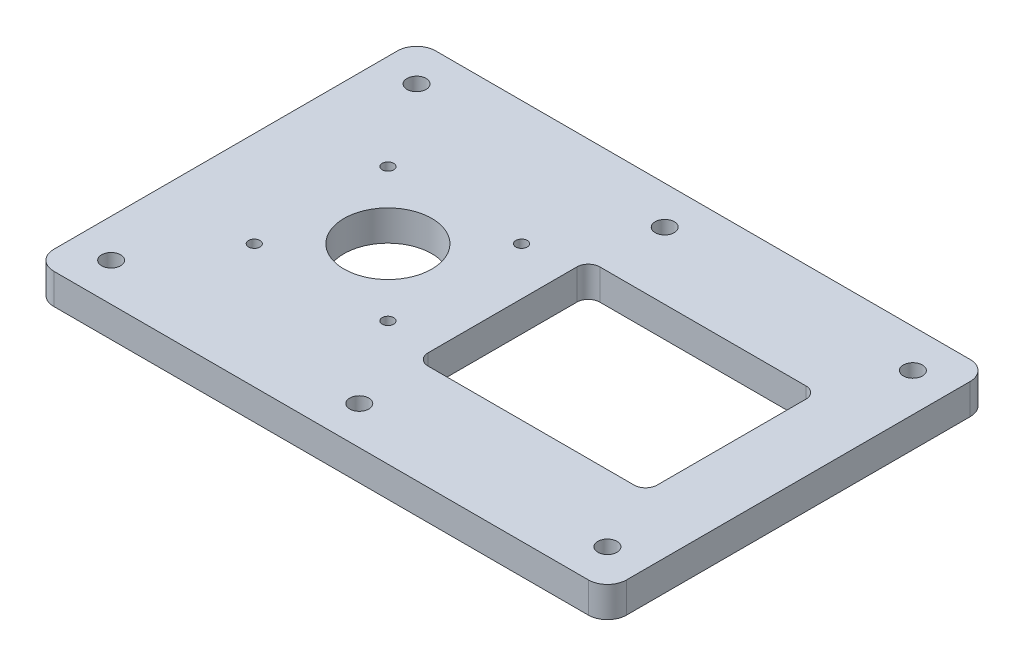
ISO-10303-21;
HEADER;
FILE_DESCRIPTION(('STEP AP214'),'2;1');
FILE_NAME('part.step','',(''),(''),'','','');
FILE_SCHEMA(('AUTOMOTIVE_DESIGN { 1 0 10303 214 1 1 1 1 }'));
ENDSEC;
DATA;
#1=APPLICATION_CONTEXT('core data for automotive mechanical design processes');
#2=APPLICATION_PROTOCOL_DEFINITION('international standard','automotive_design',2000,#1);
#3=PRODUCT_CONTEXT('',#1,'mechanical');
#4=PRODUCT('Part','Part','',(#3));
#5=PRODUCT_RELATED_PRODUCT_CATEGORY('part','',(#4));
#6=PRODUCT_DEFINITION_FORMATION('','',#4);
#7=PRODUCT_DEFINITION_CONTEXT('part definition',#1,'design');
#8=PRODUCT_DEFINITION('design','',#6,#7);
#9=PRODUCT_DEFINITION_SHAPE('','',#8);
#10=(LENGTH_UNIT() NAMED_UNIT(*) SI_UNIT(.MILLI.,.METRE.));
#11=(NAMED_UNIT(*) PLANE_ANGLE_UNIT() SI_UNIT($,.RADIAN.));
#12=(NAMED_UNIT(*) SI_UNIT($,.STERADIAN.) SOLID_ANGLE_UNIT());
#13=UNCERTAINTY_MEASURE_WITH_UNIT(LENGTH_MEASURE(1.E-05),#10,'distance_accuracy_value','');
#14=(GEOMETRIC_REPRESENTATION_CONTEXT(3) GLOBAL_UNCERTAINTY_ASSIGNED_CONTEXT((#13)) GLOBAL_UNIT_ASSIGNED_CONTEXT((#10,
#11,#12)) REPRESENTATION_CONTEXT('',''));
#15=CARTESIAN_POINT('',(0.,0.,0.));
#16=DIRECTION('',(0.,0.,1.));
#17=DIRECTION('',(1.,0.,0.));
#18=AXIS2_PLACEMENT_3D('',#15,#16,#17);
#19=CARTESIAN_POINT('',(0.,8.,22.5));
#20=DIRECTION('',(0.,0.,-1.));
#21=DIRECTION('',(-1.,0.,0.));
#22=AXIS2_PLACEMENT_3D('',#19,#20,#21);
#23=PLANE('',#22);
#24=DIRECTION('',(1.,0.,0.));
#25=VECTOR('',#24,1.);
#26=CARTESIAN_POINT('',(0.,8.,22.5));
#27=LINE('',#26,#25);
#28=CARTESIAN_POINT('',(0.499999999999999,8.,22.5));
#29=VERTEX_POINT('',#28);
#30=CARTESIAN_POINT('',(54.5,8.,22.5));
#31=VERTEX_POINT('',#30);
#32=EDGE_CURVE('E268',#29,#31,#27,.T.);
#33=ORIENTED_EDGE('',*,*,#32,.T.);
#34=DIRECTION('',(0.,-1.,0.));
#35=VECTOR('',#34,1.);
#36=CARTESIAN_POINT('',(54.5,8.,22.5));
#37=LINE('',#36,#35);
#38=CARTESIAN_POINT('',(54.5,0.,22.5));
#39=VERTEX_POINT('',#38);
#40=EDGE_CURVE('E215',#31,#39,#37,.T.);
#41=ORIENTED_EDGE('',*,*,#40,.T.);
#42=DIRECTION('',(1.,0.,0.));
#43=VECTOR('',#42,1.);
#44=CARTESIAN_POINT('',(0.,0.,22.5));
#45=LINE('',#44,#43);
#46=CARTESIAN_POINT('',(0.499999999999999,0.,22.5));
#47=VERTEX_POINT('',#46);
#48=EDGE_CURVE('E171',#47,#39,#45,.T.);
#49=ORIENTED_EDGE('',*,*,#48,.F.);
#50=DIRECTION('',(0.,-1.,0.));
#51=VECTOR('',#50,1.);
#52=CARTESIAN_POINT('',(0.499999999999999,8.,22.5));
#53=LINE('',#52,#51);
#54=EDGE_CURVE('E213',#47,#29,#53,.F.);
#55=ORIENTED_EDGE('',*,*,#54,.T.);
#56=EDGE_LOOP('',(#33,#41,#49,#55));
#57=FACE_BOUND('',#56,.T.);
#58=ADVANCED_FACE('F36',(#57),#23,.T.);
#59=CARTESIAN_POINT('',(-2.5,8.,0.));
#60=DIRECTION('',(1.,0.,0.));
#61=DIRECTION('',(0.,0.,-1.));
#62=AXIS2_PLACEMENT_3D('',#59,#60,#61);
#63=PLANE('',#62);
#64=DIRECTION('',(0.,0.,1.));
#65=VECTOR('',#64,1.);
#66=CARTESIAN_POINT('',(-2.5,8.,0.));
#67=LINE('',#66,#65);
#68=CARTESIAN_POINT('',(-2.5,8.,-19.5));
#69=VERTEX_POINT('',#68);
#70=CARTESIAN_POINT('',(-2.5,8.,19.5));
#71=VERTEX_POINT('',#70);
#72=EDGE_CURVE('E260',#69,#71,#67,.T.);
#73=ORIENTED_EDGE('',*,*,#72,.T.);
#74=DIRECTION('',(0.,-1.,0.));
#75=VECTOR('',#74,1.);
#76=CARTESIAN_POINT('',(-2.5,0.,19.5));
#77=LINE('',#76,#75);
#78=CARTESIAN_POINT('',(-2.5,0.,19.5));
#79=VERTEX_POINT('',#78);
#80=EDGE_CURVE('E229',#71,#79,#77,.T.);
#81=ORIENTED_EDGE('',*,*,#80,.T.);
#82=DIRECTION('',(0.,0.,1.));
#83=VECTOR('',#82,1.);
#84=CARTESIAN_POINT('',(-2.5,0.,0.));
#85=LINE('',#84,#83);
#86=CARTESIAN_POINT('',(-2.5,0.,-19.5));
#87=VERTEX_POINT('',#86);
#88=EDGE_CURVE('E245',#87,#79,#85,.T.);
#89=ORIENTED_EDGE('',*,*,#88,.F.);
#90=DIRECTION('',(0.,-1.,0.));
#91=VECTOR('',#90,1.);
#92=CARTESIAN_POINT('',(-2.5,8.,-19.5));
#93=LINE('',#92,#91);
#94=EDGE_CURVE('E58',#87,#69,#93,.F.);
#95=ORIENTED_EDGE('',*,*,#94,.T.);
#96=EDGE_LOOP('',(#73,#81,#89,#95));
#97=FACE_BOUND('',#96,.T.);
#98=ADVANCED_FACE('F250',(#97),#63,.T.);
#99=CARTESIAN_POINT('',(0.,8.,-22.5));
#100=DIRECTION('',(0.,0.,1.));
#101=DIRECTION('',(1.,0.,0.));
#102=AXIS2_PLACEMENT_3D('',#99,#100,#101);
#103=PLANE('',#102);
#104=DIRECTION('',(-1.,0.,0.));
#105=VECTOR('',#104,1.);
#106=CARTESIAN_POINT('',(0.,0.,-22.5));
#107=LINE('',#106,#105);
#108=CARTESIAN_POINT('',(54.5,0.,-22.5));
#109=VERTEX_POINT('',#108);
#110=CARTESIAN_POINT('',(0.499999999999998,0.,-22.5));
#111=VERTEX_POINT('',#110);
#112=EDGE_CURVE('E247',#109,#111,#107,.T.);
#113=ORIENTED_EDGE('',*,*,#112,.F.);
#114=DIRECTION('',(0.,-1.,0.));
#115=VECTOR('',#114,1.);
#116=CARTESIAN_POINT('',(54.5,8.,-22.5));
#117=LINE('',#116,#115);
#118=CARTESIAN_POINT('',(54.5,8.,-22.5));
#119=VERTEX_POINT('',#118);
#120=EDGE_CURVE('E226',#109,#119,#117,.F.);
#121=ORIENTED_EDGE('',*,*,#120,.T.);
#122=DIRECTION('',(-1.,0.,0.));
#123=VECTOR('',#122,1.);
#124=CARTESIAN_POINT('',(0.,8.,-22.5));
#125=LINE('',#124,#123);
#126=CARTESIAN_POINT('',(0.499999999999998,8.,-22.5));
#127=VERTEX_POINT('',#126);
#128=EDGE_CURVE('E258',#119,#127,#125,.T.);
#129=ORIENTED_EDGE('',*,*,#128,.T.);
#130=DIRECTION('',(0.,-1.,0.));
#131=VECTOR('',#130,1.);
#132=CARTESIAN_POINT('',(0.499999999999998,0.,-22.5));
#133=LINE('',#132,#131);
#134=EDGE_CURVE('E223',#127,#111,#133,.T.);
#135=ORIENTED_EDGE('',*,*,#134,.T.);
#136=EDGE_LOOP('',(#113,#121,#129,#135));
#137=FACE_BOUND('',#136,.T.);
#138=ADVANCED_FACE('F262',(#137),#103,.T.);
#139=CARTESIAN_POINT('',(0.,8.,50.));
#140=DIRECTION('',(0.,0.,-1.));
#141=DIRECTION('',(-1.,0.,0.));
#142=AXIS2_PLACEMENT_3D('',#139,#140,#141);
#143=PLANE('',#142);
#144=DIRECTION('',(1.,0.,0.));
#145=VECTOR('',#144,1.);
#146=CARTESIAN_POINT('',(0.,0.,50.));
#147=LINE('',#146,#145);
#148=CARTESIAN_POINT('',(-70.,0.,50.));
#149=VERTEX_POINT('',#148);
#150=CARTESIAN_POINT('',(70.,0.,50.));
#151=VERTEX_POINT('',#150);
#152=EDGE_CURVE('E156',#149,#151,#147,.T.);
#153=ORIENTED_EDGE('',*,*,#152,.T.);
#154=DIRECTION('',(0.,-1.,0.));
#155=VECTOR('',#154,1.);
#156=CARTESIAN_POINT('',(70.,8.,50.));
#157=LINE('',#156,#155);
#158=CARTESIAN_POINT('',(70.,8.,50.));
#159=VERTEX_POINT('',#158);
#160=EDGE_CURVE('E211',#151,#159,#157,.F.);
#161=ORIENTED_EDGE('',*,*,#160,.T.);
#162=DIRECTION('',(1.,0.,0.));
#163=VECTOR('',#162,1.);
#164=CARTESIAN_POINT('',(0.,8.,50.));
#165=LINE('',#164,#163);
#166=CARTESIAN_POINT('',(-70.,8.,50.));
#167=VERTEX_POINT('',#166);
#168=EDGE_CURVE('E348',#167,#159,#165,.T.);
#169=ORIENTED_EDGE('',*,*,#168,.F.);
#170=DIRECTION('',(0.,-1.,0.));
#171=VECTOR('',#170,1.);
#172=CARTESIAN_POINT('',(-70.,0.,50.));
#173=LINE('',#172,#171);
#174=EDGE_CURVE('E209',#167,#149,#173,.T.);
#175=ORIENTED_EDGE('',*,*,#174,.T.);
#176=EDGE_LOOP('',(#153,#161,#169,#175));
#177=FACE_BOUND('',#176,.T.);
#178=ADVANCED_FACE('F402',(#177),#143,.F.);
#179=CARTESIAN_POINT('',(75.,8.,0.));
#180=DIRECTION('',(-1.,0.,0.));
#181=DIRECTION('',(0.,0.,1.));
#182=AXIS2_PLACEMENT_3D('',#179,#180,#181);
#183=PLANE('',#182);
#184=DIRECTION('',(0.,0.,-1.));
#185=VECTOR('',#184,1.);
#186=CARTESIAN_POINT('',(75.,0.,0.));
#187=LINE('',#186,#185);
#188=CARTESIAN_POINT('',(75.,0.,45.));
#189=VERTEX_POINT('',#188);
#190=CARTESIAN_POINT('',(75.,0.,-45.));
#191=VERTEX_POINT('',#190);
#192=EDGE_CURVE('E302',#189,#191,#187,.T.);
#193=ORIENTED_EDGE('',*,*,#192,.T.);
#194=DIRECTION('',(0.,-1.,0.));
#195=VECTOR('',#194,1.);
#196=CARTESIAN_POINT('',(75.,8.,-45.));
#197=LINE('',#196,#195);
#198=CARTESIAN_POINT('',(75.,8.,-45.));
#199=VERTEX_POINT('',#198);
#200=EDGE_CURVE('E207',#191,#199,#197,.F.);
#201=ORIENTED_EDGE('',*,*,#200,.T.);
#202=DIRECTION('',(0.,0.,-1.));
#203=VECTOR('',#202,1.);
#204=CARTESIAN_POINT('',(75.,8.,0.));
#205=LINE('',#204,#203);
#206=CARTESIAN_POINT('',(75.,8.,45.));
#207=VERTEX_POINT('',#206);
#208=EDGE_CURVE('E351',#207,#199,#205,.T.);
#209=ORIENTED_EDGE('',*,*,#208,.F.);
#210=DIRECTION('',(0.,-1.,0.));
#211=VECTOR('',#210,1.);
#212=CARTESIAN_POINT('',(75.,8.,45.));
#213=LINE('',#212,#211);
#214=EDGE_CURVE('E204',#207,#189,#213,.T.);
#215=ORIENTED_EDGE('',*,*,#214,.T.);
#216=EDGE_LOOP('',(#193,#201,#209,#215));
#217=FACE_BOUND('',#216,.T.);
#218=ADVANCED_FACE('F398',(#217),#183,.F.);
#219=CARTESIAN_POINT('',(0.,8.,-50.));
#220=DIRECTION('',(0.,0.,-1.));
#221=DIRECTION('',(-1.,0.,0.));
#222=AXIS2_PLACEMENT_3D('',#219,#220,#221);
#223=PLANE('',#222);
#224=DIRECTION('',(1.,0.,0.));
#225=VECTOR('',#224,1.);
#226=CARTESIAN_POINT('',(0.,0.,-50.));
#227=LINE('',#226,#225);
#228=CARTESIAN_POINT('',(-70.,0.,-50.));
#229=VERTEX_POINT('',#228);
#230=CARTESIAN_POINT('',(70.,0.,-50.));
#231=VERTEX_POINT('',#230);
#232=EDGE_CURVE('E172',#229,#231,#227,.T.);
#233=ORIENTED_EDGE('',*,*,#232,.F.);
#234=DIRECTION('',(0.,-1.,0.));
#235=VECTOR('',#234,1.);
#236=CARTESIAN_POINT('',(-70.,8.,-50.));
#237=LINE('',#236,#235);
#238=CARTESIAN_POINT('',(-70.,8.,-50.));
#239=VERTEX_POINT('',#238);
#240=EDGE_CURVE('E195',#229,#239,#237,.F.);
#241=ORIENTED_EDGE('',*,*,#240,.T.);
#242=DIRECTION('',(1.,0.,0.));
#243=VECTOR('',#242,1.);
#244=CARTESIAN_POINT('',(0.,8.,-50.));
#245=LINE('',#244,#243);
#246=CARTESIAN_POINT('',(70.,8.,-50.));
#247=VERTEX_POINT('',#246);
#248=EDGE_CURVE('E354',#239,#247,#245,.T.);
#249=ORIENTED_EDGE('',*,*,#248,.T.);
#250=DIRECTION('',(0.,-1.,0.));
#251=VECTOR('',#250,1.);
#252=CARTESIAN_POINT('',(70.,0.,-50.));
#253=LINE('',#252,#251);
#254=EDGE_CURVE('E192',#247,#231,#253,.T.);
#255=ORIENTED_EDGE('',*,*,#254,.T.);
#256=EDGE_LOOP('',(#233,#241,#249,#255));
#257=FACE_BOUND('',#256,.T.);
#258=ADVANCED_FACE('F394',(#257),#223,.T.);
#259=CARTESIAN_POINT('',(-15.,8.,17.5));
#260=DIRECTION('',(0.,-1.,0.));
#261=DIRECTION('',(0.,0.,-1.));
#262=AXIS2_PLACEMENT_3D('',#259,#260,#261);
#263=CYLINDRICAL_SURFACE('',#262,1.5);
#264=CARTESIAN_POINT('',(-15.,8.,17.5));
#265=DIRECTION('',(0.,1.,0.));
#266=DIRECTION('',(0.,0.,1.));
#267=AXIS2_PLACEMENT_3D('',#264,#265,#266);
#268=CIRCLE('',#267,1.5);
#269=CARTESIAN_POINT('',(-15.,8.,19.));
#270=VERTEX_POINT('',#269);
#271=EDGE_CURVE('E181',#270,#270,#268,.T.);
#272=ORIENTED_EDGE('',*,*,#271,.T.);
#273=EDGE_LOOP('',(#272));
#274=FACE_BOUND('',#273,.T.);
#275=CARTESIAN_POINT('',(-15.,0.,17.5));
#276=DIRECTION('',(0.,1.,0.));
#277=DIRECTION('',(0.,0.,1.));
#278=AXIS2_PLACEMENT_3D('',#275,#276,#277);
#279=CIRCLE('',#278,1.5);
#280=CARTESIAN_POINT('',(-15.,0.,19.));
#281=VERTEX_POINT('',#280);
#282=EDGE_CURVE('E312',#281,#281,#279,.T.);
#283=ORIENTED_EDGE('',*,*,#282,.F.);
#284=EDGE_LOOP('',(#283));
#285=FACE_BOUND('',#284,.T.);
#286=ADVANCED_FACE('F397',(#274,#285),#263,.F.);
#287=CARTESIAN_POINT('',(57.5,8.,0.));
#288=DIRECTION('',(1.,0.,0.));
#289=DIRECTION('',(0.,0.,-1.));
#290=AXIS2_PLACEMENT_3D('',#287,#288,#289);
#291=PLANE('',#290);
#292=DIRECTION('',(0.,0.,1.));
#293=VECTOR('',#292,1.);
#294=CARTESIAN_POINT('',(57.5,0.,0.));
#295=LINE('',#294,#293);
#296=CARTESIAN_POINT('',(57.5,0.,-19.5));
#297=VERTEX_POINT('',#296);
#298=CARTESIAN_POINT('',(57.5,0.,19.5));
#299=VERTEX_POINT('',#298);
#300=EDGE_CURVE('E310',#297,#299,#295,.T.);
#301=ORIENTED_EDGE('',*,*,#300,.T.);
#302=DIRECTION('',(0.,-1.,0.));
#303=VECTOR('',#302,1.);
#304=CARTESIAN_POINT('',(57.5,8.,19.5));
#305=LINE('',#304,#303);
#306=CARTESIAN_POINT('',(57.5,8.,19.5));
#307=VERTEX_POINT('',#306);
#308=EDGE_CURVE('E221',#299,#307,#305,.F.);
#309=ORIENTED_EDGE('',*,*,#308,.T.);
#310=DIRECTION('',(0.,0.,1.));
#311=VECTOR('',#310,1.);
#312=CARTESIAN_POINT('',(57.5,8.,0.));
#313=LINE('',#312,#311);
#314=CARTESIAN_POINT('',(57.5,8.,-19.5));
#315=VERTEX_POINT('',#314);
#316=EDGE_CURVE('E264',#315,#307,#313,.T.);
#317=ORIENTED_EDGE('',*,*,#316,.F.);
#318=DIRECTION('',(0.,-1.,0.));
#319=VECTOR('',#318,1.);
#320=CARTESIAN_POINT('',(57.5,8.,-19.5));
#321=LINE('',#320,#319);
#322=EDGE_CURVE('E218',#315,#297,#321,.T.);
#323=ORIENTED_EDGE('',*,*,#322,.T.);
#324=EDGE_LOOP('',(#301,#309,#317,#323));
#325=FACE_BOUND('',#324,.T.);
#326=ADVANCED_FACE('F369',(#325),#291,.F.);
#327=CARTESIAN_POINT('',(-75.,8.,0.));
#328=DIRECTION('',(-1.,0.,0.));
#329=DIRECTION('',(0.,0.,1.));
#330=AXIS2_PLACEMENT_3D('',#327,#328,#329);
#331=PLANE('',#330);
#332=DIRECTION('',(0.,0.,-1.));
#333=VECTOR('',#332,1.);
#334=CARTESIAN_POINT('',(-75.,8.,0.));
#335=LINE('',#334,#333);
#336=CARTESIAN_POINT('',(-75.,8.,45.));
#337=VERTEX_POINT('',#336);
#338=CARTESIAN_POINT('',(-75.,8.,-45.));
#339=VERTEX_POINT('',#338);
#340=EDGE_CURVE('E357',#337,#339,#335,.T.);
#341=ORIENTED_EDGE('',*,*,#340,.T.);
#342=DIRECTION('',(0.,-1.,0.));
#343=VECTOR('',#342,1.);
#344=CARTESIAN_POINT('',(-75.,8.,-45.));
#345=LINE('',#344,#343);
#346=CARTESIAN_POINT('',(-75.,0.,-45.));
#347=VERTEX_POINT('',#346);
#348=EDGE_CURVE('E162',#339,#347,#345,.T.);
#349=ORIENTED_EDGE('',*,*,#348,.T.);
#350=DIRECTION('',(0.,0.,-1.));
#351=VECTOR('',#350,1.);
#352=CARTESIAN_POINT('',(-75.,0.,0.));
#353=LINE('',#352,#351);
#354=CARTESIAN_POINT('',(-75.,0.,45.));
#355=VERTEX_POINT('',#354);
#356=EDGE_CURVE('E154',#355,#347,#353,.T.);
#357=ORIENTED_EDGE('',*,*,#356,.F.);
#358=DIRECTION('',(0.,-1.,0.));
#359=VECTOR('',#358,1.);
#360=CARTESIAN_POINT('',(-75.,8.,45.));
#361=LINE('',#360,#359);
#362=EDGE_CURVE('E168',#355,#337,#361,.F.);
#363=ORIENTED_EDGE('',*,*,#362,.T.);
#364=EDGE_LOOP('',(#341,#349,#357,#363));
#365=FACE_BOUND('',#364,.T.);
#366=ADVANCED_FACE('F167',(#365),#331,.T.);
#367=CARTESIAN_POINT('',(8.32667268468867E-13,8.,40.));
#368=DIRECTION('',(0.,-1.,0.));
#369=DIRECTION('',(0.,0.,-1.));
#370=AXIS2_PLACEMENT_3D('',#367,#368,#369);
#371=CYLINDRICAL_SURFACE('',#370,2.5);
#372=CARTESIAN_POINT('',(8.32667268468867E-13,8.,40.));
#373=DIRECTION('',(0.,1.,0.));
#374=DIRECTION('',(0.,0.,1.));
#375=AXIS2_PLACEMENT_3D('',#372,#373,#374);
#376=CIRCLE('',#375,2.5);
#377=CARTESIAN_POINT('',(8.32667268468867E-13,8.,42.5));
#378=VERTEX_POINT('',#377);
#379=EDGE_CURVE('E345',#378,#378,#376,.T.);
#380=ORIENTED_EDGE('',*,*,#379,.T.);
#381=EDGE_LOOP('',(#380));
#382=FACE_BOUND('',#381,.T.);
#383=CARTESIAN_POINT('',(8.32667268468867E-13,0.,40.));
#384=DIRECTION('',(0.,1.,0.));
#385=DIRECTION('',(0.,0.,1.));
#386=AXIS2_PLACEMENT_3D('',#383,#384,#385);
#387=CIRCLE('',#386,2.5);
#388=CARTESIAN_POINT('',(8.32667268468867E-13,0.,42.5));
#389=VERTEX_POINT('',#388);
#390=EDGE_CURVE('E298',#389,#389,#387,.T.);
#391=ORIENTED_EDGE('',*,*,#390,.F.);
#392=EDGE_LOOP('',(#391));
#393=FACE_BOUND('',#392,.T.);
#394=ADVANCED_FACE('F393',(#382,#393),#371,.F.);
#395=CARTESIAN_POINT('',(65.0000000000008,8.,40.));
#396=DIRECTION('',(0.,-1.,0.));
#397=DIRECTION('',(0.,0.,-1.));
#398=AXIS2_PLACEMENT_3D('',#395,#396,#397);
#399=CYLINDRICAL_SURFACE('',#398,2.5);
#400=CARTESIAN_POINT('',(65.0000000000008,8.,40.));
#401=DIRECTION('',(0.,1.,0.));
#402=DIRECTION('',(0.,0.,1.));
#403=AXIS2_PLACEMENT_3D('',#400,#401,#402);
#404=CIRCLE('',#403,2.5);
#405=CARTESIAN_POINT('',(65.0000000000008,8.,42.5));
#406=VERTEX_POINT('',#405);
#407=EDGE_CURVE('E342',#406,#406,#404,.T.);
#408=ORIENTED_EDGE('',*,*,#407,.T.);
#409=EDGE_LOOP('',(#408));
#410=FACE_BOUND('',#409,.T.);
#411=CARTESIAN_POINT('',(65.0000000000008,0.,40.));
#412=DIRECTION('',(0.,1.,0.));
#413=DIRECTION('',(0.,0.,1.));
#414=AXIS2_PLACEMENT_3D('',#411,#412,#413);
#415=CIRCLE('',#414,2.5);
#416=CARTESIAN_POINT('',(65.0000000000008,0.,42.5));
#417=VERTEX_POINT('',#416);
#418=EDGE_CURVE('E295',#417,#417,#415,.T.);
#419=ORIENTED_EDGE('',*,*,#418,.F.);
#420=EDGE_LOOP('',(#419));
#421=FACE_BOUND('',#420,.T.);
#422=ADVANCED_FACE('F409',(#410,#421),#399,.F.);
#423=CARTESIAN_POINT('',(-64.9999999999992,8.,40.));
#424=DIRECTION('',(0.,-1.,0.));
#425=DIRECTION('',(0.,0.,-1.));
#426=AXIS2_PLACEMENT_3D('',#423,#424,#425);
#427=CYLINDRICAL_SURFACE('',#426,2.5);
#428=CARTESIAN_POINT('',(-64.9999999999992,8.,40.));
#429=DIRECTION('',(0.,1.,0.));
#430=DIRECTION('',(0.,0.,1.));
#431=AXIS2_PLACEMENT_3D('',#428,#429,#430);
#432=CIRCLE('',#431,2.5);
#433=CARTESIAN_POINT('',(-64.9999999999992,8.,42.5));
#434=VERTEX_POINT('',#433);
#435=EDGE_CURVE('E339',#434,#434,#432,.T.);
#436=ORIENTED_EDGE('',*,*,#435,.T.);
#437=EDGE_LOOP('',(#436));
#438=FACE_BOUND('',#437,.T.);
#439=CARTESIAN_POINT('',(-64.9999999999992,0.,40.));
#440=DIRECTION('',(0.,1.,0.));
#441=DIRECTION('',(0.,0.,1.));
#442=AXIS2_PLACEMENT_3D('',#439,#440,#441);
#443=CIRCLE('',#442,2.5);
#444=CARTESIAN_POINT('',(-64.9999999999992,0.,42.5));
#445=VERTEX_POINT('',#444);
#446=EDGE_CURVE('E292',#445,#445,#443,.T.);
#447=ORIENTED_EDGE('',*,*,#446,.F.);
#448=EDGE_LOOP('',(#447));
#449=FACE_BOUND('',#448,.T.);
#450=ADVANCED_FACE('F413',(#438,#449),#427,.F.);
#451=CARTESIAN_POINT('',(65.,8.,-40.));
#452=DIRECTION('',(0.,-1.,0.));
#453=DIRECTION('',(0.,0.,-1.));
#454=AXIS2_PLACEMENT_3D('',#451,#452,#453);
#455=CYLINDRICAL_SURFACE('',#454,2.5);
#456=CARTESIAN_POINT('',(65.,8.,-40.));
#457=DIRECTION('',(0.,1.,0.));
#458=DIRECTION('',(0.,0.,1.));
#459=AXIS2_PLACEMENT_3D('',#456,#457,#458);
#460=CIRCLE('',#459,2.5);
#461=CARTESIAN_POINT('',(65.,8.,-37.5));
#462=VERTEX_POINT('',#461);
#463=EDGE_CURVE('E336',#462,#462,#460,.T.);
#464=ORIENTED_EDGE('',*,*,#463,.T.);
#465=EDGE_LOOP('',(#464));
#466=FACE_BOUND('',#465,.T.);
#467=CARTESIAN_POINT('',(65.,0.,-40.));
#468=DIRECTION('',(0.,1.,0.));
#469=DIRECTION('',(0.,0.,1.));
#470=AXIS2_PLACEMENT_3D('',#467,#468,#469);
#471=CIRCLE('',#470,2.5);
#472=CARTESIAN_POINT('',(65.,0.,-37.5));
#473=VERTEX_POINT('',#472);
#474=EDGE_CURVE('E289',#473,#473,#471,.T.);
#475=ORIENTED_EDGE('',*,*,#474,.F.);
#476=EDGE_LOOP('',(#475));
#477=FACE_BOUND('',#476,.T.);
#478=ADVANCED_FACE('F417',(#466,#477),#455,.F.);
#479=CARTESIAN_POINT('',(0.,8.,-40.));
#480=DIRECTION('',(0.,-1.,0.));
#481=DIRECTION('',(0.,0.,-1.));
#482=AXIS2_PLACEMENT_3D('',#479,#480,#481);
#483=CYLINDRICAL_SURFACE('',#482,2.5);
#484=CARTESIAN_POINT('',(0.,8.,-40.));
#485=DIRECTION('',(0.,1.,0.));
#486=DIRECTION('',(0.,0.,1.));
#487=AXIS2_PLACEMENT_3D('',#484,#485,#486);
#488=CIRCLE('',#487,2.5);
#489=CARTESIAN_POINT('',(0.,8.,-37.5));
#490=VERTEX_POINT('',#489);
#491=EDGE_CURVE('E333',#490,#490,#488,.T.);
#492=ORIENTED_EDGE('',*,*,#491,.T.);
#493=EDGE_LOOP('',(#492));
#494=FACE_BOUND('',#493,.T.);
#495=CARTESIAN_POINT('',(0.,0.,-40.));
#496=DIRECTION('',(0.,1.,0.));
#497=DIRECTION('',(0.,0.,1.));
#498=AXIS2_PLACEMENT_3D('',#495,#496,#497);
#499=CIRCLE('',#498,2.5);
#500=CARTESIAN_POINT('',(0.,0.,-37.5));
#501=VERTEX_POINT('',#500);
#502=EDGE_CURVE('E286',#501,#501,#499,.T.);
#503=ORIENTED_EDGE('',*,*,#502,.F.);
#504=EDGE_LOOP('',(#503));
#505=FACE_BOUND('',#504,.T.);
#506=ADVANCED_FACE('F421',(#494,#505),#483,.F.);
#507=CARTESIAN_POINT('',(-65.,8.,-40.));
#508=DIRECTION('',(0.,-1.,0.));
#509=DIRECTION('',(0.,0.,-1.));
#510=AXIS2_PLACEMENT_3D('',#507,#508,#509);
#511=CYLINDRICAL_SURFACE('',#510,2.5);
#512=CARTESIAN_POINT('',(-65.,8.,-40.));
#513=DIRECTION('',(0.,1.,0.));
#514=DIRECTION('',(0.,0.,1.));
#515=AXIS2_PLACEMENT_3D('',#512,#513,#514);
#516=CIRCLE('',#515,2.5);
#517=CARTESIAN_POINT('',(-65.,8.,-37.5));
#518=VERTEX_POINT('',#517);
#519=EDGE_CURVE('E330',#518,#518,#516,.T.);
#520=ORIENTED_EDGE('',*,*,#519,.T.);
#521=EDGE_LOOP('',(#520));
#522=FACE_BOUND('',#521,.T.);
#523=CARTESIAN_POINT('',(-65.,0.,-40.));
#524=DIRECTION('',(0.,1.,0.));
#525=DIRECTION('',(0.,0.,1.));
#526=AXIS2_PLACEMENT_3D('',#523,#524,#525);
#527=CIRCLE('',#526,2.5);
#528=CARTESIAN_POINT('',(-65.,0.,-37.5));
#529=VERTEX_POINT('',#528);
#530=EDGE_CURVE('E283',#529,#529,#527,.T.);
#531=ORIENTED_EDGE('',*,*,#530,.F.);
#532=EDGE_LOOP('',(#531));
#533=FACE_BOUND('',#532,.T.);
#534=ADVANCED_FACE('F425',(#522,#533),#511,.F.);
#535=CARTESIAN_POINT('',(-50.,8.,17.5));
#536=DIRECTION('',(0.,-1.,0.));
#537=DIRECTION('',(0.,0.,-1.));
#538=AXIS2_PLACEMENT_3D('',#535,#536,#537);
#539=CYLINDRICAL_SURFACE('',#538,1.5);
#540=CARTESIAN_POINT('',(-50.,8.,17.5));
#541=DIRECTION('',(0.,1.,0.));
#542=DIRECTION('',(0.,0.,1.));
#543=AXIS2_PLACEMENT_3D('',#540,#541,#542);
#544=CIRCLE('',#543,1.5);
#545=CARTESIAN_POINT('',(-50.,8.,19.));
#546=VERTEX_POINT('',#545);
#547=EDGE_CURVE('E325',#546,#546,#544,.T.);
#548=ORIENTED_EDGE('',*,*,#547,.T.);
#549=EDGE_LOOP('',(#548));
#550=FACE_BOUND('',#549,.T.);
#551=CARTESIAN_POINT('',(-50.,0.,17.5));
#552=DIRECTION('',(0.,1.,0.));
#553=DIRECTION('',(0.,0.,1.));
#554=AXIS2_PLACEMENT_3D('',#551,#552,#553);
#555=CIRCLE('',#554,1.5);
#556=CARTESIAN_POINT('',(-50.,0.,19.));
#557=VERTEX_POINT('',#556);
#558=EDGE_CURVE('E280',#557,#557,#555,.T.);
#559=ORIENTED_EDGE('',*,*,#558,.F.);
#560=EDGE_LOOP('',(#559));
#561=FACE_BOUND('',#560,.T.);
#562=ADVANCED_FACE('F429',(#550,#561),#539,.F.);
#563=CARTESIAN_POINT('',(-15.,8.,-17.5));
#564=DIRECTION('',(0.,-1.,0.));
#565=DIRECTION('',(0.,0.,-1.));
#566=AXIS2_PLACEMENT_3D('',#563,#564,#565);
#567=CYLINDRICAL_SURFACE('',#566,1.5);
#568=CARTESIAN_POINT('',(-15.,8.,-17.5));
#569=DIRECTION('',(0.,1.,0.));
#570=DIRECTION('',(0.,0.,1.));
#571=AXIS2_PLACEMENT_3D('',#568,#569,#570);
#572=CIRCLE('',#571,1.5);
#573=CARTESIAN_POINT('',(-15.,8.,-16.));
#574=VERTEX_POINT('',#573);
#575=EDGE_CURVE('E320',#574,#574,#572,.T.);
#576=ORIENTED_EDGE('',*,*,#575,.T.);
#577=EDGE_LOOP('',(#576));
#578=FACE_BOUND('',#577,.T.);
#579=CARTESIAN_POINT('',(-15.,0.,-17.5));
#580=DIRECTION('',(0.,1.,0.));
#581=DIRECTION('',(0.,0.,1.));
#582=AXIS2_PLACEMENT_3D('',#579,#580,#581);
#583=CIRCLE('',#582,1.5);
#584=CARTESIAN_POINT('',(-15.,0.,-16.));
#585=VERTEX_POINT('',#584);
#586=EDGE_CURVE('E277',#585,#585,#583,.T.);
#587=ORIENTED_EDGE('',*,*,#586,.F.);
#588=EDGE_LOOP('',(#587));
#589=FACE_BOUND('',#588,.T.);
#590=ADVANCED_FACE('F433',(#578,#589),#567,.F.);
#591=CARTESIAN_POINT('',(-50.,8.,-17.5));
#592=DIRECTION('',(0.,-1.,0.));
#593=DIRECTION('',(0.,0.,-1.));
#594=AXIS2_PLACEMENT_3D('',#591,#592,#593);
#595=CYLINDRICAL_SURFACE('',#594,1.5);
#596=CARTESIAN_POINT('',(-50.,8.,-17.5));
#597=DIRECTION('',(0.,1.,0.));
#598=DIRECTION('',(0.,0.,1.));
#599=AXIS2_PLACEMENT_3D('',#596,#597,#598);
#600=CIRCLE('',#599,1.5);
#601=CARTESIAN_POINT('',(-50.,8.,-16.));
#602=VERTEX_POINT('',#601);
#603=EDGE_CURVE('E316',#602,#602,#600,.T.);
#604=ORIENTED_EDGE('',*,*,#603,.T.);
#605=EDGE_LOOP('',(#604));
#606=FACE_BOUND('',#605,.T.);
#607=CARTESIAN_POINT('',(-50.,0.,-17.5));
#608=DIRECTION('',(0.,1.,0.));
#609=DIRECTION('',(0.,0.,1.));
#610=AXIS2_PLACEMENT_3D('',#607,#608,#609);
#611=CIRCLE('',#610,1.5);
#612=CARTESIAN_POINT('',(-50.,0.,-16.));
#613=VERTEX_POINT('',#612);
#614=EDGE_CURVE('E274',#613,#613,#611,.T.);
#615=ORIENTED_EDGE('',*,*,#614,.F.);
#616=EDGE_LOOP('',(#615));
#617=FACE_BOUND('',#616,.T.);
#618=ADVANCED_FACE('F437',(#606,#617),#595,.F.);
#619=CARTESIAN_POINT('',(-32.5,8.,0.));
#620=DIRECTION('',(0.,-1.,0.));
#621=DIRECTION('',(0.,0.,-1.));
#622=AXIS2_PLACEMENT_3D('',#619,#620,#621);
#623=CYLINDRICAL_SURFACE('',#622,11.5);
#624=CARTESIAN_POINT('',(-32.5,8.,0.));
#625=DIRECTION('',(0.,1.,0.));
#626=DIRECTION('',(0.,0.,1.));
#627=AXIS2_PLACEMENT_3D('',#624,#625,#626);
#628=CIRCLE('',#627,11.5);
#629=CARTESIAN_POINT('',(-32.5,8.,11.5));
#630=VERTEX_POINT('',#629);
#631=EDGE_CURVE('E177',#630,#630,#628,.T.);
#632=ORIENTED_EDGE('',*,*,#631,.T.);
#633=EDGE_LOOP('',(#632));
#634=FACE_BOUND('',#633,.T.);
#635=CARTESIAN_POINT('',(-32.5,0.,0.));
#636=DIRECTION('',(0.,1.,0.));
#637=DIRECTION('',(0.,0.,1.));
#638=AXIS2_PLACEMENT_3D('',#635,#636,#637);
#639=CIRCLE('',#638,11.5);
#640=CARTESIAN_POINT('',(-32.5,0.,11.5));
#641=VERTEX_POINT('',#640);
#642=EDGE_CURVE('E184',#641,#641,#639,.T.);
#643=ORIENTED_EDGE('',*,*,#642,.F.);
#644=EDGE_LOOP('',(#643));
#645=FACE_BOUND('',#644,.T.);
#646=ADVANCED_FACE('F441',(#634,#645),#623,.F.);
#647=CARTESIAN_POINT('',(0.,8.,0.));
#648=DIRECTION('',(0.,1.,0.));
#649=DIRECTION('',(0.,0.,1.));
#650=AXIS2_PLACEMENT_3D('',#647,#648,#649);
#651=PLANE('',#650);
#652=ORIENTED_EDGE('',*,*,#603,.F.);
#653=EDGE_LOOP('',(#652));
#654=FACE_BOUND('',#653,.T.);
#655=ORIENTED_EDGE('',*,*,#575,.F.);
#656=EDGE_LOOP('',(#655));
#657=FACE_BOUND('',#656,.T.);
#658=ORIENTED_EDGE('',*,*,#547,.F.);
#659=EDGE_LOOP('',(#658));
#660=FACE_BOUND('',#659,.T.);
#661=ORIENTED_EDGE('',*,*,#519,.F.);
#662=EDGE_LOOP('',(#661));
#663=FACE_BOUND('',#662,.T.);
#664=ORIENTED_EDGE('',*,*,#491,.F.);
#665=EDGE_LOOP('',(#664));
#666=FACE_BOUND('',#665,.T.);
#667=ORIENTED_EDGE('',*,*,#463,.F.);
#668=EDGE_LOOP('',(#667));
#669=FACE_BOUND('',#668,.T.);
#670=ORIENTED_EDGE('',*,*,#435,.F.);
#671=EDGE_LOOP('',(#670));
#672=FACE_BOUND('',#671,.T.);
#673=ORIENTED_EDGE('',*,*,#407,.F.);
#674=EDGE_LOOP('',(#673));
#675=FACE_BOUND('',#674,.T.);
#676=ORIENTED_EDGE('',*,*,#379,.F.);
#677=EDGE_LOOP('',(#676));
#678=FACE_BOUND('',#677,.T.);
#679=ORIENTED_EDGE('',*,*,#248,.F.);
#680=CARTESIAN_POINT('',(-70.,8.,-45.));
#681=DIRECTION('',(0.,1.,0.));
#682=DIRECTION('',(0.,0.,1.));
#683=AXIS2_PLACEMENT_3D('',#680,#681,#682);
#684=CIRCLE('',#683,5.);
#685=EDGE_CURVE('E202',#239,#339,#684,.T.);
#686=ORIENTED_EDGE('',*,*,#685,.T.);
#687=ORIENTED_EDGE('',*,*,#340,.F.);
#688=CARTESIAN_POINT('',(-70.,8.,45.));
#689=DIRECTION('',(0.,1.,0.));
#690=DIRECTION('',(0.,0.,1.));
#691=AXIS2_PLACEMENT_3D('',#688,#689,#690);
#692=CIRCLE('',#691,5.);
#693=EDGE_CURVE('E176',#337,#167,#692,.T.);
#694=ORIENTED_EDGE('',*,*,#693,.T.);
#695=ORIENTED_EDGE('',*,*,#168,.T.);
#696=CARTESIAN_POINT('',(70.,8.,45.));
#697=DIRECTION('',(0.,1.,0.));
#698=DIRECTION('',(0.,0.,1.));
#699=AXIS2_PLACEMENT_3D('',#696,#697,#698);
#700=CIRCLE('',#699,5.);
#701=EDGE_CURVE('E198',#159,#207,#700,.T.);
#702=ORIENTED_EDGE('',*,*,#701,.T.);
#703=ORIENTED_EDGE('',*,*,#208,.T.);
#704=CARTESIAN_POINT('',(70.,8.,-45.));
#705=DIRECTION('',(0.,1.,0.));
#706=DIRECTION('',(0.,0.,1.));
#707=AXIS2_PLACEMENT_3D('',#704,#705,#706);
#708=CIRCLE('',#707,5.);
#709=EDGE_CURVE('E200',#199,#247,#708,.T.);
#710=ORIENTED_EDGE('',*,*,#709,.T.);
#711=EDGE_LOOP('',(#679,#686,#687,#694,#695,#702,#703,#710));
#712=FACE_BOUND('',#711,.T.);
#713=ORIENTED_EDGE('',*,*,#32,.F.);
#714=CARTESIAN_POINT('',(0.499999999999998,8.,19.5));
#715=DIRECTION('',(0.,1.,0.));
#716=DIRECTION('',(0.,0.,1.));
#717=AXIS2_PLACEMENT_3D('',#714,#715,#716);
#718=CIRCLE('',#717,3.);
#719=EDGE_CURVE('E51',#29,#71,#718,.F.);
#720=ORIENTED_EDGE('',*,*,#719,.T.);
#721=ORIENTED_EDGE('',*,*,#72,.F.);
#722=CARTESIAN_POINT('',(0.499999999999998,8.,-19.5));
#723=DIRECTION('',(0.,1.,0.));
#724=DIRECTION('',(0.,0.,1.));
#725=AXIS2_PLACEMENT_3D('',#722,#723,#724);
#726=CIRCLE('',#725,3.);
#727=EDGE_CURVE('E11',#69,#127,#726,.F.);
#728=ORIENTED_EDGE('',*,*,#727,.T.);
#729=ORIENTED_EDGE('',*,*,#128,.F.);
#730=CARTESIAN_POINT('',(54.5,8.,-19.5));
#731=DIRECTION('',(0.,1.,0.));
#732=DIRECTION('',(0.,0.,1.));
#733=AXIS2_PLACEMENT_3D('',#730,#731,#732);
#734=CIRCLE('',#733,3.);
#735=EDGE_CURVE('E238',#119,#315,#734,.F.);
#736=ORIENTED_EDGE('',*,*,#735,.T.);
#737=ORIENTED_EDGE('',*,*,#316,.T.);
#738=CARTESIAN_POINT('',(54.5,8.,19.5));
#739=DIRECTION('',(0.,1.,0.));
#740=DIRECTION('',(0.,0.,1.));
#741=AXIS2_PLACEMENT_3D('',#738,#739,#740);
#742=CIRCLE('',#741,3.);
#743=EDGE_CURVE('E234',#307,#31,#742,.F.);
#744=ORIENTED_EDGE('',*,*,#743,.T.);
#745=EDGE_LOOP('',(#713,#720,#721,#728,#729,#736,#737,#744));
#746=FACE_BOUND('',#745,.T.);
#747=ORIENTED_EDGE('',*,*,#271,.F.);
#748=EDGE_LOOP('',(#747));
#749=FACE_BOUND('',#748,.T.);
#750=ORIENTED_EDGE('',*,*,#631,.F.);
#751=EDGE_LOOP('',(#750));
#752=FACE_BOUND('',#751,.T.);
#753=ADVANCED_FACE('F256',(#654,#657,#660,#663,#666,#669,#672,#675,#678,#712,#746,#749,#752),
#651,.T.);
#754=CARTESIAN_POINT('',(0.,0.,0.));
#755=DIRECTION('',(0.,1.,0.));
#756=DIRECTION('',(0.,0.,1.));
#757=AXIS2_PLACEMENT_3D('',#754,#755,#756);
#758=PLANE('',#757);
#759=ORIENTED_EDGE('',*,*,#614,.T.);
#760=EDGE_LOOP('',(#759));
#761=FACE_BOUND('',#760,.T.);
#762=ORIENTED_EDGE('',*,*,#586,.T.);
#763=EDGE_LOOP('',(#762));
#764=FACE_BOUND('',#763,.T.);
#765=ORIENTED_EDGE('',*,*,#558,.T.);
#766=EDGE_LOOP('',(#765));
#767=FACE_BOUND('',#766,.T.);
#768=ORIENTED_EDGE('',*,*,#530,.T.);
#769=EDGE_LOOP('',(#768));
#770=FACE_BOUND('',#769,.T.);
#771=ORIENTED_EDGE('',*,*,#502,.T.);
#772=EDGE_LOOP('',(#771));
#773=FACE_BOUND('',#772,.T.);
#774=ORIENTED_EDGE('',*,*,#474,.T.);
#775=EDGE_LOOP('',(#774));
#776=FACE_BOUND('',#775,.T.);
#777=ORIENTED_EDGE('',*,*,#446,.T.);
#778=EDGE_LOOP('',(#777));
#779=FACE_BOUND('',#778,.T.);
#780=ORIENTED_EDGE('',*,*,#418,.T.);
#781=EDGE_LOOP('',(#780));
#782=FACE_BOUND('',#781,.T.);
#783=ORIENTED_EDGE('',*,*,#390,.T.);
#784=EDGE_LOOP('',(#783));
#785=FACE_BOUND('',#784,.T.);
#786=ORIENTED_EDGE('',*,*,#356,.T.);
#787=CARTESIAN_POINT('',(-70.,0.,-45.));
#788=DIRECTION('',(0.,1.,0.));
#789=DIRECTION('',(0.,0.,1.));
#790=AXIS2_PLACEMENT_3D('',#787,#788,#789);
#791=CIRCLE('',#790,5.);
#792=EDGE_CURVE('E190',#347,#229,#791,.F.);
#793=ORIENTED_EDGE('',*,*,#792,.T.);
#794=ORIENTED_EDGE('',*,*,#232,.T.);
#795=CARTESIAN_POINT('',(70.,0.,-45.));
#796=DIRECTION('',(0.,1.,0.));
#797=DIRECTION('',(0.,0.,1.));
#798=AXIS2_PLACEMENT_3D('',#795,#796,#797);
#799=CIRCLE('',#798,5.);
#800=EDGE_CURVE('E188',#231,#191,#799,.F.);
#801=ORIENTED_EDGE('',*,*,#800,.T.);
#802=ORIENTED_EDGE('',*,*,#192,.F.);
#803=CARTESIAN_POINT('',(70.,0.,45.));
#804=DIRECTION('',(0.,1.,0.));
#805=DIRECTION('',(0.,0.,1.));
#806=AXIS2_PLACEMENT_3D('',#803,#804,#805);
#807=CIRCLE('',#806,5.);
#808=EDGE_CURVE('E161',#189,#151,#807,.F.);
#809=ORIENTED_EDGE('',*,*,#808,.T.);
#810=ORIENTED_EDGE('',*,*,#152,.F.);
#811=CARTESIAN_POINT('',(-70.,0.,45.));
#812=DIRECTION('',(0.,1.,0.));
#813=DIRECTION('',(0.,0.,1.));
#814=AXIS2_PLACEMENT_3D('',#811,#812,#813);
#815=CIRCLE('',#814,5.);
#816=EDGE_CURVE('E150',#149,#355,#815,.F.);
#817=ORIENTED_EDGE('',*,*,#816,.T.);
#818=EDGE_LOOP('',(#786,#793,#794,#801,#802,#809,#810,#817));
#819=FACE_BOUND('',#818,.T.);
#820=ORIENTED_EDGE('',*,*,#88,.T.);
#821=CARTESIAN_POINT('',(0.499999999999998,0.,19.5));
#822=DIRECTION('',(0.,1.,0.));
#823=DIRECTION('',(0.,0.,1.));
#824=AXIS2_PLACEMENT_3D('',#821,#822,#823);
#825=CIRCLE('',#824,3.);
#826=EDGE_CURVE('E240',#79,#47,#825,.T.);
#827=ORIENTED_EDGE('',*,*,#826,.T.);
#828=ORIENTED_EDGE('',*,*,#48,.T.);
#829=CARTESIAN_POINT('',(54.5,0.,19.5));
#830=DIRECTION('',(0.,1.,0.));
#831=DIRECTION('',(0.,0.,1.));
#832=AXIS2_PLACEMENT_3D('',#829,#830,#831);
#833=CIRCLE('',#832,3.);
#834=EDGE_CURVE('E232',#39,#299,#833,.T.);
#835=ORIENTED_EDGE('',*,*,#834,.T.);
#836=ORIENTED_EDGE('',*,*,#300,.F.);
#837=CARTESIAN_POINT('',(54.5,0.,-19.5));
#838=DIRECTION('',(0.,1.,0.));
#839=DIRECTION('',(0.,0.,1.));
#840=AXIS2_PLACEMENT_3D('',#837,#838,#839);
#841=CIRCLE('',#840,3.);
#842=EDGE_CURVE('E236',#297,#109,#841,.T.);
#843=ORIENTED_EDGE('',*,*,#842,.T.);
#844=ORIENTED_EDGE('',*,*,#112,.T.);
#845=CARTESIAN_POINT('',(0.499999999999998,0.,-19.5));
#846=DIRECTION('',(0.,1.,0.));
#847=DIRECTION('',(0.,0.,1.));
#848=AXIS2_PLACEMENT_3D('',#845,#846,#847);
#849=CIRCLE('',#848,3.);
#850=EDGE_CURVE('E44',#111,#87,#849,.T.);
#851=ORIENTED_EDGE('',*,*,#850,.T.);
#852=EDGE_LOOP('',(#820,#827,#828,#835,#836,#843,#844,#851));
#853=FACE_BOUND('',#852,.T.);
#854=ORIENTED_EDGE('',*,*,#282,.T.);
#855=EDGE_LOOP('',(#854));
#856=FACE_BOUND('',#855,.T.);
#857=ORIENTED_EDGE('',*,*,#642,.T.);
#858=EDGE_LOOP('',(#857));
#859=FACE_BOUND('',#858,.T.);
#860=ADVANCED_FACE('F152',(#761,#764,#767,#770,#773,#776,#779,#782,#785,#819,#853,#856,#859),
#758,.F.);
#861=CARTESIAN_POINT('',(-70.,8.,-45.));
#862=DIRECTION('',(0.,-1.,0.));
#863=DIRECTION('',(0.,0.,-1.));
#864=AXIS2_PLACEMENT_3D('',#861,#862,#863);
#865=CYLINDRICAL_SURFACE('',#864,5.);
#866=ORIENTED_EDGE('',*,*,#685,.F.);
#867=ORIENTED_EDGE('',*,*,#240,.F.);
#868=ORIENTED_EDGE('',*,*,#792,.F.);
#869=ORIENTED_EDGE('',*,*,#348,.F.);
#870=EDGE_LOOP('',(#866,#867,#868,#869));
#871=FACE_BOUND('',#870,.T.);
#872=ADVANCED_FACE('F442',(#871),#865,.T.);
#873=CARTESIAN_POINT('',(70.,8.,-45.));
#874=DIRECTION('',(0.,1.,0.));
#875=DIRECTION('',(0.,0.,1.));
#876=AXIS2_PLACEMENT_3D('',#873,#874,#875);
#877=CYLINDRICAL_SURFACE('',#876,5.);
#878=ORIENTED_EDGE('',*,*,#709,.F.);
#879=ORIENTED_EDGE('',*,*,#200,.F.);
#880=ORIENTED_EDGE('',*,*,#800,.F.);
#881=ORIENTED_EDGE('',*,*,#254,.F.);
#882=EDGE_LOOP('',(#878,#879,#880,#881));
#883=FACE_BOUND('',#882,.T.);
#884=ADVANCED_FACE('F445',(#883),#877,.T.);
#885=CARTESIAN_POINT('',(70.,8.,45.));
#886=DIRECTION('',(0.,-1.,0.));
#887=DIRECTION('',(0.,0.,-1.));
#888=AXIS2_PLACEMENT_3D('',#885,#886,#887);
#889=CYLINDRICAL_SURFACE('',#888,5.);
#890=ORIENTED_EDGE('',*,*,#701,.F.);
#891=ORIENTED_EDGE('',*,*,#160,.F.);
#892=ORIENTED_EDGE('',*,*,#808,.F.);
#893=ORIENTED_EDGE('',*,*,#214,.F.);
#894=EDGE_LOOP('',(#890,#891,#892,#893));
#895=FACE_BOUND('',#894,.T.);
#896=ADVANCED_FACE('F449',(#895),#889,.T.);
#897=CARTESIAN_POINT('',(-70.,8.,45.));
#898=DIRECTION('',(0.,1.,0.));
#899=DIRECTION('',(0.,0.,1.));
#900=AXIS2_PLACEMENT_3D('',#897,#898,#899);
#901=CYLINDRICAL_SURFACE('',#900,5.);
#902=ORIENTED_EDGE('',*,*,#693,.F.);
#903=ORIENTED_EDGE('',*,*,#362,.F.);
#904=ORIENTED_EDGE('',*,*,#816,.F.);
#905=ORIENTED_EDGE('',*,*,#174,.F.);
#906=EDGE_LOOP('',(#902,#903,#904,#905));
#907=FACE_BOUND('',#906,.T.);
#908=ADVANCED_FACE('F175',(#907),#901,.T.);
#909=CARTESIAN_POINT('',(54.5,8.,19.5));
#910=DIRECTION('',(0.,-1.,0.));
#911=DIRECTION('',(0.,0.,-1.));
#912=AXIS2_PLACEMENT_3D('',#909,#910,#911);
#913=CYLINDRICAL_SURFACE('',#912,3.);
#914=ORIENTED_EDGE('',*,*,#743,.F.);
#915=ORIENTED_EDGE('',*,*,#308,.F.);
#916=ORIENTED_EDGE('',*,*,#834,.F.);
#917=ORIENTED_EDGE('',*,*,#40,.F.);
#918=EDGE_LOOP('',(#914,#915,#916,#917));
#919=FACE_BOUND('',#918,.T.);
#920=ADVANCED_FACE('F365',(#919),#913,.F.);
#921=CARTESIAN_POINT('',(54.5,8.,-19.5));
#922=DIRECTION('',(0.,-1.,0.));
#923=DIRECTION('',(0.,0.,-1.));
#924=AXIS2_PLACEMENT_3D('',#921,#922,#923);
#925=CYLINDRICAL_SURFACE('',#924,3.);
#926=ORIENTED_EDGE('',*,*,#735,.F.);
#927=ORIENTED_EDGE('',*,*,#120,.F.);
#928=ORIENTED_EDGE('',*,*,#842,.F.);
#929=ORIENTED_EDGE('',*,*,#322,.F.);
#930=EDGE_LOOP('',(#926,#927,#928,#929));
#931=FACE_BOUND('',#930,.T.);
#932=ADVANCED_FACE('F373',(#931),#925,.F.);
#933=CARTESIAN_POINT('',(0.499999999999998,8.,19.5));
#934=DIRECTION('',(0.,1.,0.));
#935=DIRECTION('',(0.,0.,1.));
#936=AXIS2_PLACEMENT_3D('',#933,#934,#935);
#937=CYLINDRICAL_SURFACE('',#936,3.);
#938=ORIENTED_EDGE('',*,*,#719,.F.);
#939=ORIENTED_EDGE('',*,*,#54,.F.);
#940=ORIENTED_EDGE('',*,*,#826,.F.);
#941=ORIENTED_EDGE('',*,*,#80,.F.);
#942=EDGE_LOOP('',(#938,#939,#940,#941));
#943=FACE_BOUND('',#942,.T.);
#944=ADVANCED_FACE('F375',(#943),#937,.F.);
#945=CARTESIAN_POINT('',(0.499999999999998,8.,-19.5));
#946=DIRECTION('',(0.,1.,0.));
#947=DIRECTION('',(0.,0.,1.));
#948=AXIS2_PLACEMENT_3D('',#945,#946,#947);
#949=CYLINDRICAL_SURFACE('',#948,3.);
#950=ORIENTED_EDGE('',*,*,#727,.F.);
#951=ORIENTED_EDGE('',*,*,#94,.F.);
#952=ORIENTED_EDGE('',*,*,#850,.F.);
#953=ORIENTED_EDGE('',*,*,#134,.F.);
#954=EDGE_LOOP('',(#950,#951,#952,#953));
#955=FACE_BOUND('',#954,.T.);
#956=ADVANCED_FACE('F38',(#955),#949,.F.);
#957=CLOSED_SHELL('',(#58,#98,#138,#178,#218,#258,#286,#326,#366,#394,#422,#450,#478,#506,#534,
#562,#590,#618,#646,#753,#860,#872,#884,#896,#908,#920,#932,#944,#956));
#958=MANIFOLD_SOLID_BREP('B2',#957);
#959=ADVANCED_BREP_SHAPE_REPRESENTATION('',(#18,#958),#14);
#960=SHAPE_DEFINITION_REPRESENTATION(#9,#959);
ENDSEC;
END-ISO-10303-21;
